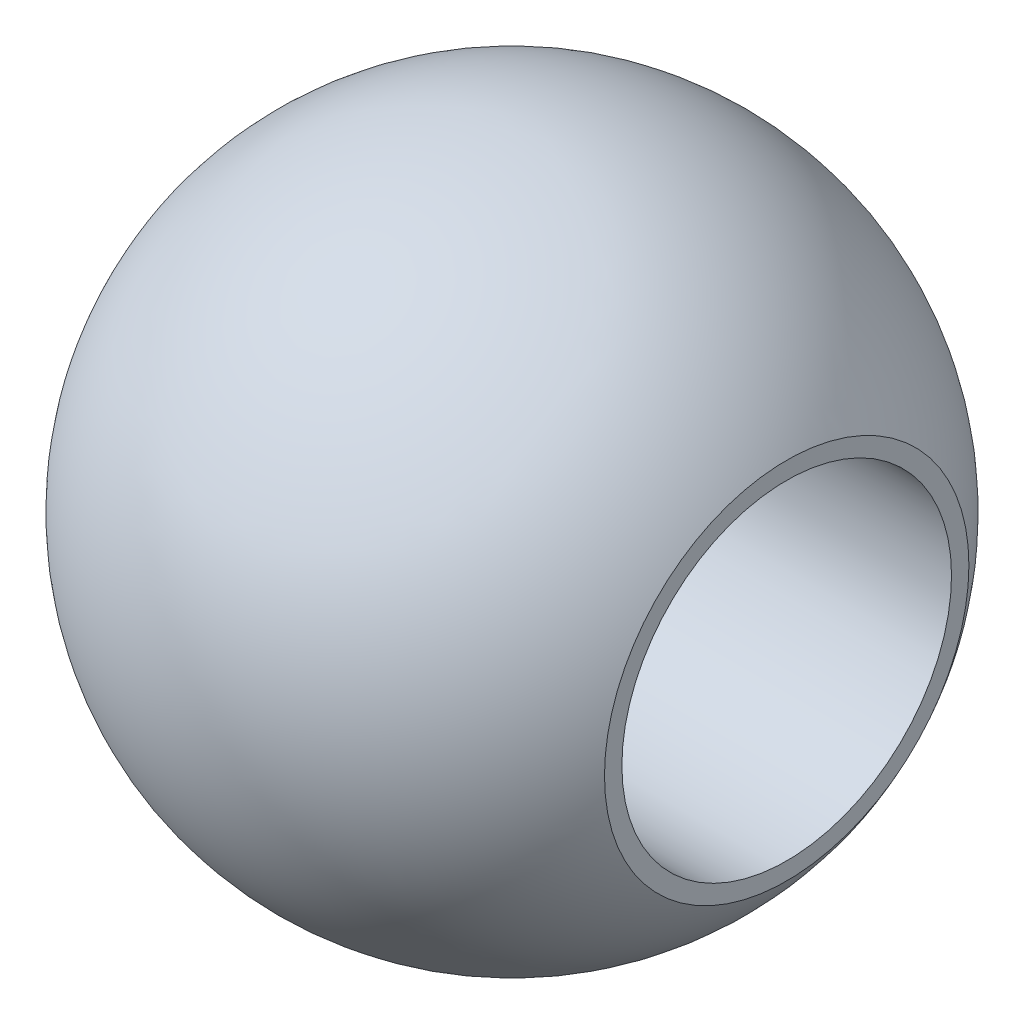
ISO-10303-21;
HEADER;
FILE_DESCRIPTION(('STEP AP214'),'2;1');
FILE_NAME('part.step','',(''),(''),'','','');
FILE_SCHEMA(('AUTOMOTIVE_DESIGN { 1 0 10303 214 1 1 1 1 }'));
ENDSEC;
DATA;
#1=APPLICATION_CONTEXT('core data for automotive mechanical design processes');
#2=APPLICATION_PROTOCOL_DEFINITION('international standard','automotive_design',2000,#1);
#3=PRODUCT_CONTEXT('',#1,'mechanical');
#4=PRODUCT('Part','Part','',(#3));
#5=PRODUCT_RELATED_PRODUCT_CATEGORY('part','',(#4));
#6=PRODUCT_DEFINITION_FORMATION('','',#4);
#7=PRODUCT_DEFINITION_CONTEXT('part definition',#1,'design');
#8=PRODUCT_DEFINITION('design','',#6,#7);
#9=PRODUCT_DEFINITION_SHAPE('','',#8);
#10=(LENGTH_UNIT() NAMED_UNIT(*) SI_UNIT(.MILLI.,.METRE.));
#11=(NAMED_UNIT(*) PLANE_ANGLE_UNIT() SI_UNIT($,.RADIAN.));
#12=(NAMED_UNIT(*) SI_UNIT($,.STERADIAN.) SOLID_ANGLE_UNIT());
#13=UNCERTAINTY_MEASURE_WITH_UNIT(LENGTH_MEASURE(1.E-05),#10,'distance_accuracy_value','');
#14=(GEOMETRIC_REPRESENTATION_CONTEXT(3) GLOBAL_UNCERTAINTY_ASSIGNED_CONTEXT((#13)) GLOBAL_UNIT_ASSIGNED_CONTEXT((#10,
#11,#12)) REPRESENTATION_CONTEXT('',''));
#15=CARTESIAN_POINT('',(0.,0.,0.));
#16=DIRECTION('',(0.,0.,1.));
#17=DIRECTION('',(1.,0.,0.));
#18=AXIS2_PLACEMENT_3D('',#15,#16,#17);
#19=CARTESIAN_POINT('',(0.,0.,0.));
#20=DIRECTION('',(0.,0.,-1.));
#21=DIRECTION('',(1.,0.,0.));
#22=AXIS2_PLACEMENT_3D('',#19,#20,#21);
#23=SPHERICAL_SURFACE('',#22,3.);
#24=CARTESIAN_POINT('',(0.,0.,0.));
#25=DIRECTION('',(1.,0.,0.));
#26=DIRECTION('',(0.,0.,-1.));
#27=AXIS2_PLACEMENT_3D('',#24,#25,#26);
#28=SPHERICAL_SURFACE('',#27,3.);
#29=CARTESIAN_POINT('',(-2.5,0.,0.));
#30=DIRECTION('',(1.,0.,0.));
#31=DIRECTION('',(0.,0.,-1.));
#32=AXIS2_PLACEMENT_3D('',#29,#30,#31);
#33=CIRCLE('',#32,1.6583123951777);
#34=CARTESIAN_POINT('',(-2.5,0.,-1.6583123951777));
#35=VERTEX_POINT('',#34);
#36=EDGE_CURVE('E10',#35,#35,#33,.T.);
#37=ORIENTED_EDGE('',*,*,#36,.T.);
#38=EDGE_LOOP('',(#37));
#39=FACE_BOUND('',#38,.T.);
#40=CARTESIAN_POINT('',(2.5,0.,0.));
#41=DIRECTION('',(-1.,0.,0.));
#42=DIRECTION('',(0.,0.,1.));
#43=AXIS2_PLACEMENT_3D('',#40,#41,#42);
#44=CIRCLE('',#43,1.6583123951777);
#45=CARTESIAN_POINT('',(2.5,0.,1.6583123951777));
#46=VERTEX_POINT('',#45);
#47=EDGE_CURVE('E49',#46,#46,#44,.T.);
#48=ORIENTED_EDGE('',*,*,#47,.T.);
#49=EDGE_LOOP('',(#48));
#50=FACE_BOUND('',#49,.T.);
#51=ADVANCED_FACE('F42',(#39,#50),#28,.T.);
#52=CARTESIAN_POINT('',(2.5,10.,3.05669219739097));
#53=DIRECTION('',(-1.,0.,0.));
#54=DIRECTION('',(0.,0.,1.));
#55=AXIS2_PLACEMENT_3D('',#52,#53,#54);
#56=PLANE('',#55);
#57=CARTESIAN_POINT('',(2.5,0.,0.));
#58=DIRECTION('',(1.,0.,0.));
#59=DIRECTION('',(0.,0.,-1.));
#60=AXIS2_PLACEMENT_3D('',#57,#58,#59);
#61=CIRCLE('',#60,1.5);
#62=CARTESIAN_POINT('',(2.5,0.,-1.5));
#63=VERTEX_POINT('',#62);
#64=EDGE_CURVE('E55',#63,#63,#61,.T.);
#65=ORIENTED_EDGE('',*,*,#64,.F.);
#66=EDGE_LOOP('',(#65));
#67=FACE_BOUND('',#66,.T.);
#68=ORIENTED_EDGE('',*,*,#47,.F.);
#69=EDGE_LOOP('',(#68));
#70=FACE_BOUND('',#69,.T.);
#71=ADVANCED_FACE('F71',(#67,#70),#56,.F.);
#72=CARTESIAN_POINT('',(-2.5,10.,3.05669219739097));
#73=DIRECTION('',(1.,0.,0.));
#74=DIRECTION('',(0.,0.,-1.));
#75=AXIS2_PLACEMENT_3D('',#72,#73,#74);
#76=PLANE('',#75);
#77=CARTESIAN_POINT('',(-2.5,0.,0.));
#78=DIRECTION('',(1.,0.,0.));
#79=DIRECTION('',(0.,0.,-1.));
#80=AXIS2_PLACEMENT_3D('',#77,#78,#79);
#81=CIRCLE('',#80,1.5);
#82=CARTESIAN_POINT('',(-2.5,0.,-1.5));
#83=VERTEX_POINT('',#82);
#84=EDGE_CURVE('E45',#83,#83,#81,.T.);
#85=ORIENTED_EDGE('',*,*,#84,.T.);
#86=EDGE_LOOP('',(#85));
#87=FACE_BOUND('',#86,.T.);
#88=ORIENTED_EDGE('',*,*,#36,.F.);
#89=EDGE_LOOP('',(#88));
#90=FACE_BOUND('',#89,.T.);
#91=ADVANCED_FACE('F62',(#87,#90),#76,.F.);
#92=CARTESIAN_POINT('',(-7.5,0.,0.));
#93=DIRECTION('',(1.,0.,0.));
#94=DIRECTION('',(0.,0.,-1.));
#95=AXIS2_PLACEMENT_3D('',#92,#93,#94);
#96=CYLINDRICAL_SURFACE('',#95,1.5);
#97=ORIENTED_EDGE('',*,*,#64,.T.);
#98=EDGE_LOOP('',(#97));
#99=FACE_BOUND('',#98,.T.);
#100=ORIENTED_EDGE('',*,*,#84,.F.);
#101=EDGE_LOOP('',(#100));
#102=FACE_BOUND('',#101,.T.);
#103=ADVANCED_FACE('F65',(#99,#102),#96,.F.);
#104=CLOSED_SHELL('',(#51,#71,#91,#103));
#105=MANIFOLD_SOLID_BREP('B2',#104);
#106=ADVANCED_BREP_SHAPE_REPRESENTATION('',(#18,#105),#14);
#107=SHAPE_DEFINITION_REPRESENTATION(#9,#106);
ENDSEC;
END-ISO-10303-21;
